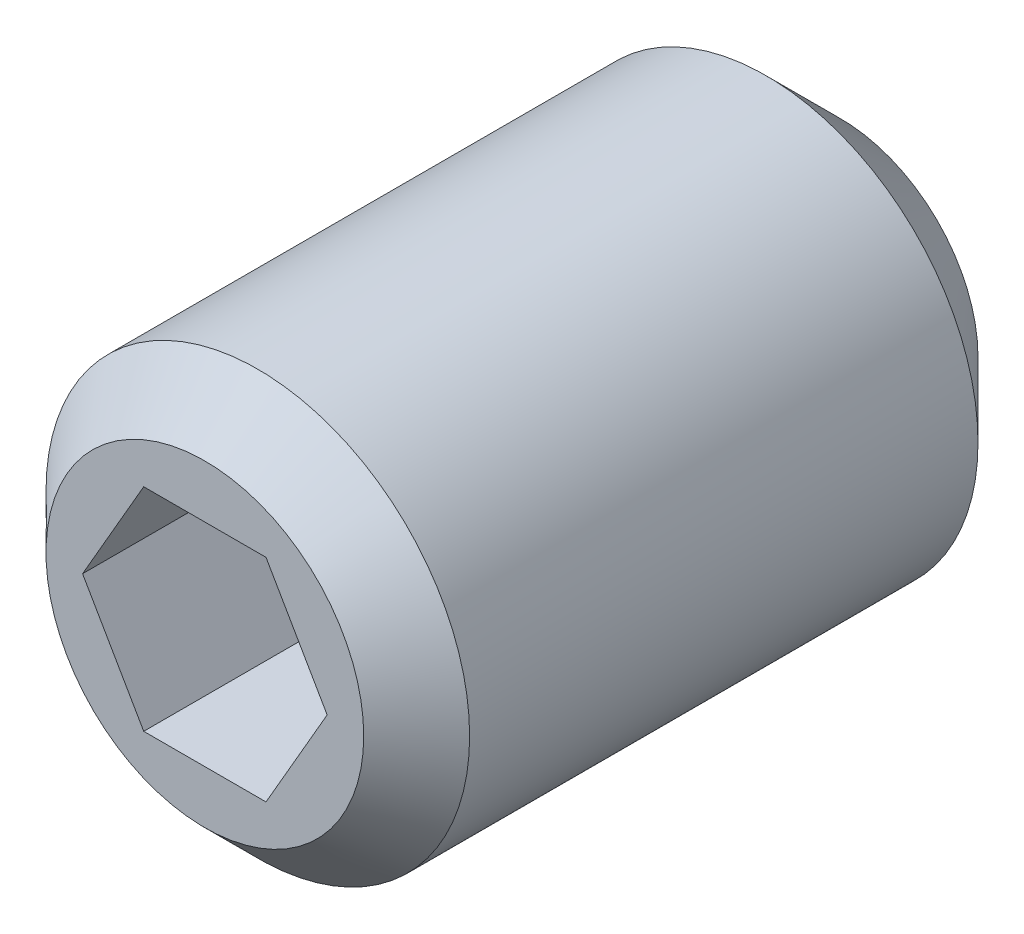
ISO-10303-21;
HEADER;
FILE_DESCRIPTION(('STEP AP214'),'2;1');
FILE_NAME('part.step','',(''),(''),'','','');
FILE_SCHEMA(('AUTOMOTIVE_DESIGN { 1 0 10303 214 1 1 1 1 }'));
ENDSEC;
DATA;
#1=APPLICATION_CONTEXT('core data for automotive mechanical design processes');
#2=APPLICATION_PROTOCOL_DEFINITION('international standard','automotive_design',2000,#1);
#3=PRODUCT_CONTEXT('',#1,'mechanical');
#4=PRODUCT('Part','Part','',(#3));
#5=PRODUCT_RELATED_PRODUCT_CATEGORY('part','',(#4));
#6=PRODUCT_DEFINITION_FORMATION('','',#4);
#7=PRODUCT_DEFINITION_CONTEXT('part definition',#1,'design');
#8=PRODUCT_DEFINITION('design','',#6,#7);
#9=PRODUCT_DEFINITION_SHAPE('','',#8);
#10=(LENGTH_UNIT() NAMED_UNIT(*) SI_UNIT(.MILLI.,.METRE.));
#11=(NAMED_UNIT(*) PLANE_ANGLE_UNIT() SI_UNIT($,.RADIAN.));
#12=(NAMED_UNIT(*) SI_UNIT($,.STERADIAN.) SOLID_ANGLE_UNIT());
#13=UNCERTAINTY_MEASURE_WITH_UNIT(LENGTH_MEASURE(1.E-05),#10,'distance_accuracy_value','');
#14=(GEOMETRIC_REPRESENTATION_CONTEXT(3) GLOBAL_UNCERTAINTY_ASSIGNED_CONTEXT((#13)) GLOBAL_UNIT_ASSIGNED_CONTEXT((#10,
#11,#12)) REPRESENTATION_CONTEXT('',''));
#15=CARTESIAN_POINT('',(0.,0.,0.));
#16=DIRECTION('',(0.,0.,1.));
#17=DIRECTION('',(1.,0.,0.));
#18=AXIS2_PLACEMENT_3D('',#15,#16,#17);
#19=CARTESIAN_POINT('',(0.,0.,3.));
#20=DIRECTION('',(0.,0.,-1.));
#21=DIRECTION('',(-1.,0.,0.));
#22=AXIS2_PLACEMENT_3D('',#19,#20,#21);
#23=CYLINDRICAL_SURFACE('',#22,2.);
#24=CARTESIAN_POINT('',(0.,0.,2.5));
#25=DIRECTION('',(0.,0.,1.));
#26=DIRECTION('',(1.,0.,0.));
#27=AXIS2_PLACEMENT_3D('',#24,#25,#26);
#28=CIRCLE('',#27,2.);
#29=CARTESIAN_POINT('',(2.,0.,2.5));
#30=VERTEX_POINT('',#29);
#31=EDGE_CURVE('E11',#30,#30,#28,.F.);
#32=ORIENTED_EDGE('',*,*,#31,.T.);
#33=EDGE_LOOP('',(#32));
#34=FACE_BOUND('',#33,.T.);
#35=CARTESIAN_POINT('',(0.,0.,-2.29999999999999));
#36=DIRECTION('',(0.,0.,1.));
#37=DIRECTION('',(1.,0.,0.));
#38=AXIS2_PLACEMENT_3D('',#35,#36,#37);
#39=CIRCLE('',#38,2.);
#40=CARTESIAN_POINT('',(2.,0.,-2.29999999999999));
#41=VERTEX_POINT('',#40);
#42=EDGE_CURVE('E118',#41,#41,#39,.T.);
#43=ORIENTED_EDGE('',*,*,#42,.T.);
#44=EDGE_LOOP('',(#43));
#45=FACE_BOUND('',#44,.T.);
#46=ADVANCED_FACE('F43',(#34,#45),#23,.T.);
#47=CARTESIAN_POINT('',(0.,0.,3.));
#48=DIRECTION('',(0.,0.,1.));
#49=DIRECTION('',(1.,0.,0.));
#50=AXIS2_PLACEMENT_3D('',#47,#48,#49);
#51=PLANE('',#50);
#52=CARTESIAN_POINT('',(0.,0.,3.));
#53=DIRECTION('',(0.,0.,1.));
#54=DIRECTION('',(1.,0.,0.));
#55=AXIS2_PLACEMENT_3D('',#52,#53,#54);
#56=CIRCLE('',#55,1.49999999999999);
#57=CARTESIAN_POINT('',(1.49999999999999,0.,3.));
#58=VERTEX_POINT('',#57);
#59=EDGE_CURVE('E51',#58,#58,#56,.T.);
#60=ORIENTED_EDGE('',*,*,#59,.T.);
#61=EDGE_LOOP('',(#60));
#62=FACE_BOUND('',#61,.T.);
#63=DIRECTION('',(-0.5,0.866025403784439,0.));
#64=VECTOR('',#63,1.);
#65=CARTESIAN_POINT('',(1.15470053837925,0.,3.));
#66=LINE('',#65,#64);
#67=CARTESIAN_POINT('',(1.15470053837925,0.,3.));
#68=VERTEX_POINT('',#67);
#69=CARTESIAN_POINT('',(0.577350269189626,1.,3.));
#70=VERTEX_POINT('',#69);
#71=EDGE_CURVE('E58',#68,#70,#66,.T.);
#72=ORIENTED_EDGE('',*,*,#71,.F.);
#73=DIRECTION('',(0.5,0.866025403784439,0.));
#74=VECTOR('',#73,1.);
#75=CARTESIAN_POINT('',(0.577350269189626,-1.,3.));
#76=LINE('',#75,#74);
#77=CARTESIAN_POINT('',(0.577350269189626,-1.,3.));
#78=VERTEX_POINT('',#77);
#79=EDGE_CURVE('E93',#78,#68,#76,.T.);
#80=ORIENTED_EDGE('',*,*,#79,.F.);
#81=DIRECTION('',(1.,0.,0.));
#82=VECTOR('',#81,1.);
#83=CARTESIAN_POINT('',(-0.577350269189626,-1.,3.));
#84=LINE('',#83,#82);
#85=CARTESIAN_POINT('',(-0.577350269189626,-1.,3.));
#86=VERTEX_POINT('',#85);
#87=EDGE_CURVE('E101',#86,#78,#84,.T.);
#88=ORIENTED_EDGE('',*,*,#87,.F.);
#89=DIRECTION('',(0.499999999999999,-0.866025403784439,0.));
#90=VECTOR('',#89,1.);
#91=CARTESIAN_POINT('',(-1.15470053837925,0.,3.));
#92=LINE('',#91,#90);
#93=CARTESIAN_POINT('',(-1.15470053837925,0.,3.));
#94=VERTEX_POINT('',#93);
#95=EDGE_CURVE('E107',#94,#86,#92,.T.);
#96=ORIENTED_EDGE('',*,*,#95,.F.);
#97=DIRECTION('',(-0.499999999999999,-0.866025403784439,0.));
#98=VECTOR('',#97,1.);
#99=CARTESIAN_POINT('',(-0.577350269189626,1.,3.));
#100=LINE('',#99,#98);
#101=CARTESIAN_POINT('',(-0.577350269189626,1.,3.));
#102=VERTEX_POINT('',#101);
#103=EDGE_CURVE('E376',#102,#94,#100,.T.);
#104=ORIENTED_EDGE('',*,*,#103,.F.);
#105=DIRECTION('',(-1.,0.,0.));
#106=VECTOR('',#105,1.);
#107=CARTESIAN_POINT('',(0.577350269189626,1.,3.));
#108=LINE('',#107,#106);
#109=EDGE_CURVE('E359',#70,#102,#108,.T.);
#110=ORIENTED_EDGE('',*,*,#109,.F.);
#111=EDGE_LOOP('',(#72,#80,#88,#96,#104,#110));
#112=FACE_BOUND('',#111,.T.);
#113=ADVANCED_FACE('F109',(#62,#112),#51,.T.);
#114=CARTESIAN_POINT('',(0.,0.,-3.));
#115=DIRECTION('',(0.,0.,1.));
#116=DIRECTION('',(1.,0.,0.));
#117=AXIS2_PLACEMENT_3D('',#114,#115,#116);
#118=PLANE('',#117);
#119=CARTESIAN_POINT('',(0.,0.,-3.));
#120=DIRECTION('',(0.,0.,1.));
#121=DIRECTION('',(1.,0.,0.));
#122=AXIS2_PLACEMENT_3D('',#119,#120,#121);
#123=CIRCLE('',#122,1.3);
#124=CARTESIAN_POINT('',(1.3,0.,-3.));
#125=VERTEX_POINT('',#124);
#126=EDGE_CURVE('E129',#125,#125,#123,.F.);
#127=ORIENTED_EDGE('',*,*,#126,.T.);
#128=EDGE_LOOP('',(#127));
#129=FACE_BOUND('',#128,.T.);
#130=ADVANCED_FACE('F151',(#129),#118,.F.);
#131=CARTESIAN_POINT('',(0.,0.,-2.29999999999999));
#132=DIRECTION('',(0.,0.,1.));
#133=DIRECTION('',(1.,0.,0.));
#134=AXIS2_PLACEMENT_3D('',#131,#132,#133);
#135=CONICAL_SURFACE('',#134,2.,0.785398163397443);
#136=ORIENTED_EDGE('',*,*,#126,.F.);
#137=EDGE_LOOP('',(#136));
#138=FACE_BOUND('',#137,.T.);
#139=ORIENTED_EDGE('',*,*,#42,.F.);
#140=EDGE_LOOP('',(#139));
#141=FACE_BOUND('',#140,.T.);
#142=ADVANCED_FACE('F155',(#138,#141),#135,.T.);
#143=CARTESIAN_POINT('',(1.15470053837925,0.,1.));
#144=DIRECTION('',(0.866025403784439,0.5,0.));
#145=DIRECTION('',(-0.5,0.866025403784439,0.));
#146=AXIS2_PLACEMENT_3D('',#143,#144,#145);
#147=PLANE('',#146);
#148=ORIENTED_EDGE('',*,*,#71,.T.);
#149=DIRECTION('',(0.,0.,1.));
#150=VECTOR('',#149,1.);
#151=CARTESIAN_POINT('',(0.577350269189626,1.,1.));
#152=LINE('',#151,#150);
#153=CARTESIAN_POINT('',(0.577350269189626,1.,1.));
#154=VERTEX_POINT('',#153);
#155=EDGE_CURVE('E125',#154,#70,#152,.T.);
#156=ORIENTED_EDGE('',*,*,#155,.F.);
#157=DIRECTION('',(-0.5,0.866025403784439,0.));
#158=VECTOR('',#157,1.);
#159=CARTESIAN_POINT('',(1.15470053837925,0.,1.));
#160=LINE('',#159,#158);
#161=CARTESIAN_POINT('',(1.15470053837925,0.,1.));
#162=VERTEX_POINT('',#161);
#163=EDGE_CURVE('E111',#162,#154,#160,.T.);
#164=ORIENTED_EDGE('',*,*,#163,.F.);
#165=DIRECTION('',(0.,0.,1.));
#166=VECTOR('',#165,1.);
#167=CARTESIAN_POINT('',(1.15470053837925,0.,1.));
#168=LINE('',#167,#166);
#169=EDGE_CURVE('E97',#162,#68,#168,.T.);
#170=ORIENTED_EDGE('',*,*,#169,.T.);
#171=EDGE_LOOP('',(#148,#156,#164,#170));
#172=FACE_BOUND('',#171,.T.);
#173=ADVANCED_FACE('F157',(#172),#147,.F.);
#174=CARTESIAN_POINT('',(0.577350269189626,-1.,1.));
#175=DIRECTION('',(0.866025403784439,-0.499999999999999,0.));
#176=DIRECTION('',(0.5,0.866025403784439,0.));
#177=AXIS2_PLACEMENT_3D('',#174,#175,#176);
#178=PLANE('',#177);
#179=ORIENTED_EDGE('',*,*,#79,.T.);
#180=ORIENTED_EDGE('',*,*,#169,.F.);
#181=DIRECTION('',(0.5,0.866025403784439,0.));
#182=VECTOR('',#181,1.);
#183=CARTESIAN_POINT('',(0.577350269189626,-1.,1.));
#184=LINE('',#183,#182);
#185=CARTESIAN_POINT('',(0.577350269189626,-1.,1.));
#186=VERTEX_POINT('',#185);
#187=EDGE_CURVE('E95',#186,#162,#184,.T.);
#188=ORIENTED_EDGE('',*,*,#187,.F.);
#189=DIRECTION('',(0.,0.,1.));
#190=VECTOR('',#189,1.);
#191=CARTESIAN_POINT('',(0.577350269189626,-1.,1.));
#192=LINE('',#191,#190);
#193=EDGE_CURVE('E88',#186,#78,#192,.T.);
#194=ORIENTED_EDGE('',*,*,#193,.T.);
#195=EDGE_LOOP('',(#179,#180,#188,#194));
#196=FACE_BOUND('',#195,.T.);
#197=ADVANCED_FACE('F90',(#196),#178,.F.);
#198=CARTESIAN_POINT('',(-0.577350269189626,-1.,1.));
#199=DIRECTION('',(0.,-1.,0.));
#200=DIRECTION('',(1.,0.,0.));
#201=AXIS2_PLACEMENT_3D('',#198,#199,#200);
#202=PLANE('',#201);
#203=ORIENTED_EDGE('',*,*,#87,.T.);
#204=ORIENTED_EDGE('',*,*,#193,.F.);
#205=DIRECTION('',(1.,0.,0.));
#206=VECTOR('',#205,1.);
#207=CARTESIAN_POINT('',(-0.577350269189626,-1.,1.));
#208=LINE('',#207,#206);
#209=CARTESIAN_POINT('',(-0.577350269189626,-1.,1.));
#210=VERTEX_POINT('',#209);
#211=EDGE_CURVE('E67',#210,#186,#208,.T.);
#212=ORIENTED_EDGE('',*,*,#211,.F.);
#213=DIRECTION('',(0.,0.,1.));
#214=VECTOR('',#213,1.);
#215=CARTESIAN_POINT('',(-0.577350269189626,-1.,1.));
#216=LINE('',#215,#214);
#217=EDGE_CURVE('E98',#210,#86,#216,.T.);
#218=ORIENTED_EDGE('',*,*,#217,.T.);
#219=EDGE_LOOP('',(#203,#204,#212,#218));
#220=FACE_BOUND('',#219,.T.);
#221=ADVANCED_FACE('F102',(#220),#202,.F.);
#222=CARTESIAN_POINT('',(-1.15470053837925,0.,1.));
#223=DIRECTION('',(-0.866025403784439,-0.499999999999999,0.));
#224=DIRECTION('',(0.499999999999999,-0.866025403784439,0.));
#225=AXIS2_PLACEMENT_3D('',#222,#223,#224);
#226=PLANE('',#225);
#227=ORIENTED_EDGE('',*,*,#95,.T.);
#228=ORIENTED_EDGE('',*,*,#217,.F.);
#229=DIRECTION('',(0.499999999999999,-0.866025403784439,0.));
#230=VECTOR('',#229,1.);
#231=CARTESIAN_POINT('',(-1.15470053837925,0.,1.));
#232=LINE('',#231,#230);
#233=CARTESIAN_POINT('',(-1.15470053837925,0.,1.));
#234=VERTEX_POINT('',#233);
#235=EDGE_CURVE('E366',#234,#210,#232,.T.);
#236=ORIENTED_EDGE('',*,*,#235,.F.);
#237=DIRECTION('',(0.,0.,1.));
#238=VECTOR('',#237,1.);
#239=CARTESIAN_POINT('',(-1.15470053837925,0.,1.));
#240=LINE('',#239,#238);
#241=EDGE_CURVE('E121',#234,#94,#240,.T.);
#242=ORIENTED_EDGE('',*,*,#241,.T.);
#243=EDGE_LOOP('',(#227,#228,#236,#242));
#244=FACE_BOUND('',#243,.T.);
#245=ADVANCED_FACE('F203',(#244),#226,.F.);
#246=CARTESIAN_POINT('',(-0.577350269189626,1.,1.));
#247=DIRECTION('',(-0.866025403784439,0.499999999999999,0.));
#248=DIRECTION('',(-0.499999999999999,-0.866025403784439,0.));
#249=AXIS2_PLACEMENT_3D('',#246,#247,#248);
#250=PLANE('',#249);
#251=ORIENTED_EDGE('',*,*,#103,.T.);
#252=ORIENTED_EDGE('',*,*,#241,.F.);
#253=DIRECTION('',(-0.499999999999999,-0.866025403784439,0.));
#254=VECTOR('',#253,1.);
#255=CARTESIAN_POINT('',(-0.577350269189626,1.,1.));
#256=LINE('',#255,#254);
#257=CARTESIAN_POINT('',(-0.577350269189626,1.,1.));
#258=VERTEX_POINT('',#257);
#259=EDGE_CURVE('E355',#258,#234,#256,.T.);
#260=ORIENTED_EDGE('',*,*,#259,.F.);
#261=DIRECTION('',(0.,0.,1.));
#262=VECTOR('',#261,1.);
#263=CARTESIAN_POINT('',(-0.577350269189626,1.,1.));
#264=LINE('',#263,#262);
#265=EDGE_CURVE('E123',#258,#102,#264,.T.);
#266=ORIENTED_EDGE('',*,*,#265,.T.);
#267=EDGE_LOOP('',(#251,#252,#260,#266));
#268=FACE_BOUND('',#267,.T.);
#269=ADVANCED_FACE('F212',(#268),#250,.F.);
#270=CARTESIAN_POINT('',(0.577350269189626,1.,1.));
#271=DIRECTION('',(0.,1.,0.));
#272=DIRECTION('',(-1.,0.,0.));
#273=AXIS2_PLACEMENT_3D('',#270,#271,#272);
#274=PLANE('',#273);
#275=ORIENTED_EDGE('',*,*,#109,.T.);
#276=ORIENTED_EDGE('',*,*,#265,.F.);
#277=DIRECTION('',(-1.,0.,0.));
#278=VECTOR('',#277,1.);
#279=CARTESIAN_POINT('',(0.577350269189626,1.,1.));
#280=LINE('',#279,#278);
#281=EDGE_CURVE('E114',#154,#258,#280,.T.);
#282=ORIENTED_EDGE('',*,*,#281,.F.);
#283=ORIENTED_EDGE('',*,*,#155,.T.);
#284=EDGE_LOOP('',(#275,#276,#282,#283));
#285=FACE_BOUND('',#284,.T.);
#286=ADVANCED_FACE('F222',(#285),#274,.F.);
#287=CARTESIAN_POINT('',(-0.577350269189626,-1.,1.));
#288=CARTESIAN_POINT('',(-0.548482755730145,-0.950000000000001,0.5));
#289=CARTESIAN_POINT('',(0.,0.,0.5));
#290=CARTESIAN_POINT('',(0.577350269189626,-1.,1.));
#291=CARTESIAN_POINT('',(0.548482755730144,-0.95,0.5));
#292=CARTESIAN_POINT('',(0.,0.,0.5));
#293=(BOUNDED_SURFACE() B_SPLINE_SURFACE(1,2,((#287,#288,#289),(#290,#291,#292)),.UNSPECIFIED.,
.F.,.F.,.F.) B_SPLINE_SURFACE_WITH_KNOTS((2,2),(3,3),(0.,1.),(0.,1.),
.UNSPECIFIED.) GEOMETRIC_REPRESENTATION_ITEM() RATIONAL_B_SPLINE_SURFACE(((1.,1.,1.),(1.,1.,1.))) REPRESENTATION_ITEM('') SURFACE());
#294=CARTESIAN_POINT('',(0.577350269189626,-1.,1.));
#295=CARTESIAN_POINT('',(0.548482755730144,-0.95,0.5));
#296=CARTESIAN_POINT('',(0.,0.,0.5));
#297=(BOUNDED_CURVE() B_SPLINE_CURVE(2,(#294,#295,#296),.UNSPECIFIED.,.F.,
.F.) B_SPLINE_CURVE_WITH_KNOTS((3,3),(0.,1.),
.UNSPECIFIED.) CURVE() GEOMETRIC_REPRESENTATION_ITEM() RATIONAL_B_SPLINE_CURVE((1.,1.,1.)) REPRESENTATION_ITEM(''));
#298=CARTESIAN_POINT('',(0.,0.,0.5));
#299=VERTEX_POINT('',#298);
#300=EDGE_CURVE('E374',#186,#299,#297,.T.);
#301=CARTESIAN_POINT('',(-0.577350269189626,-1.,1.));
#302=CARTESIAN_POINT('',(-0.548482755730145,-0.950000000000001,0.5));
#303=CARTESIAN_POINT('',(0.,0.,0.5));
#304=(BOUNDED_CURVE() B_SPLINE_CURVE(2,(#301,#302,#303),.UNSPECIFIED.,.F.,
.F.) B_SPLINE_CURVE_WITH_KNOTS((3,3),(0.,1.),
.UNSPECIFIED.) CURVE() GEOMETRIC_REPRESENTATION_ITEM() RATIONAL_B_SPLINE_CURVE((1.,1.,1.)) REPRESENTATION_ITEM(''));
#305=EDGE_CURVE('E381',#210,#299,#304,.T.);
#306=ORIENTED_EDGE('',*,*,#211,.T.);
#307=ORIENTED_EDGE('',*,*,#300,.T.);
#308=ORIENTED_EDGE('',*,*,#305,.F.);
#309=EDGE_LOOP('',(#306,#307,#308));
#310=FACE_BOUND('',#309,.T.);
#311=ADVANCED_FACE('F232',(#310),#293,.T.);
#312=CARTESIAN_POINT('',(-1.15470053837925,0.,1.));
#313=CARTESIAN_POINT('',(-1.09696551146029,0.,0.5));
#314=CARTESIAN_POINT('',(0.,0.,0.5));
#315=CARTESIAN_POINT('',(-0.577350269189626,-1.,1.));
#316=CARTESIAN_POINT('',(-0.548482755730145,-0.950000000000001,0.5));
#317=CARTESIAN_POINT('',(0.,0.,0.5));
#318=(BOUNDED_SURFACE() B_SPLINE_SURFACE(1,2,((#312,#313,#314),(#315,#316,#317)),.UNSPECIFIED.,
.F.,.F.,.F.) B_SPLINE_SURFACE_WITH_KNOTS((2,2),(3,3),(0.,1.),(0.,1.),
.UNSPECIFIED.) GEOMETRIC_REPRESENTATION_ITEM() RATIONAL_B_SPLINE_SURFACE(((1.,1.,1.),(1.,1.,1.))) REPRESENTATION_ITEM('') SURFACE());
#319=CARTESIAN_POINT('',(-1.15470053837925,0.,1.));
#320=CARTESIAN_POINT('',(-1.09696551146029,0.,0.5));
#321=CARTESIAN_POINT('',(0.,0.,0.5));
#322=(BOUNDED_CURVE() B_SPLINE_CURVE(2,(#319,#320,#321),.UNSPECIFIED.,.F.,
.F.) B_SPLINE_CURVE_WITH_KNOTS((3,3),(0.,1.),
.UNSPECIFIED.) CURVE() GEOMETRIC_REPRESENTATION_ITEM() RATIONAL_B_SPLINE_CURVE((1.,1.,1.)) REPRESENTATION_ITEM(''));
#323=EDGE_CURVE('E382',#234,#299,#322,.T.);
#324=ORIENTED_EDGE('',*,*,#235,.T.);
#325=ORIENTED_EDGE('',*,*,#305,.T.);
#326=ORIENTED_EDGE('',*,*,#323,.F.);
#327=EDGE_LOOP('',(#324,#325,#326));
#328=FACE_BOUND('',#327,.T.);
#329=ADVANCED_FACE('F242',(#328),#318,.T.);
#330=CARTESIAN_POINT('',(-0.577350269189626,1.,1.));
#331=CARTESIAN_POINT('',(-0.548482755730144,0.950000000000001,0.5));
#332=CARTESIAN_POINT('',(0.,0.,0.5));
#333=CARTESIAN_POINT('',(-1.15470053837925,0.,1.));
#334=CARTESIAN_POINT('',(-1.09696551146029,0.,0.5));
#335=CARTESIAN_POINT('',(0.,0.,0.5));
#336=(BOUNDED_SURFACE() B_SPLINE_SURFACE(1,2,((#330,#331,#332),(#333,#334,#335)),.UNSPECIFIED.,
.F.,.F.,.F.) B_SPLINE_SURFACE_WITH_KNOTS((2,2),(3,3),(0.,1.),(0.,1.),
.UNSPECIFIED.) GEOMETRIC_REPRESENTATION_ITEM() RATIONAL_B_SPLINE_SURFACE(((1.,1.,1.),(1.,1.,1.))) REPRESENTATION_ITEM('') SURFACE());
#337=CARTESIAN_POINT('',(-0.577350269189626,1.,1.));
#338=CARTESIAN_POINT('',(-0.548482755730144,0.950000000000001,0.5));
#339=CARTESIAN_POINT('',(0.,0.,0.5));
#340=(BOUNDED_CURVE() B_SPLINE_CURVE(2,(#337,#338,#339),.UNSPECIFIED.,.F.,
.F.) B_SPLINE_CURVE_WITH_KNOTS((3,3),(0.,1.),
.UNSPECIFIED.) CURVE() GEOMETRIC_REPRESENTATION_ITEM() RATIONAL_B_SPLINE_CURVE((1.,1.,1.)) REPRESENTATION_ITEM(''));
#341=EDGE_CURVE('E349',#258,#299,#340,.T.);
#342=ORIENTED_EDGE('',*,*,#259,.T.);
#343=ORIENTED_EDGE('',*,*,#323,.T.);
#344=ORIENTED_EDGE('',*,*,#341,.F.);
#345=EDGE_LOOP('',(#342,#343,#344));
#346=FACE_BOUND('',#345,.T.);
#347=ADVANCED_FACE('F251',(#346),#336,.T.);
#348=CARTESIAN_POINT('',(0.577350269189626,-1.,1.));
#349=CARTESIAN_POINT('',(0.548482755730144,-0.95,0.5));
#350=CARTESIAN_POINT('',(0.,0.,0.5));
#351=CARTESIAN_POINT('',(1.15470053837925,0.,1.));
#352=CARTESIAN_POINT('',(1.09696551146029,0.,0.5));
#353=CARTESIAN_POINT('',(0.,0.,0.5));
#354=(BOUNDED_SURFACE() B_SPLINE_SURFACE(1,2,((#348,#349,#350),(#351,#352,#353)),.UNSPECIFIED.,
.F.,.F.,.F.) B_SPLINE_SURFACE_WITH_KNOTS((2,2),(3,3),(0.,1.),(0.,1.),
.UNSPECIFIED.) GEOMETRIC_REPRESENTATION_ITEM() RATIONAL_B_SPLINE_SURFACE(((1.,1.,1.),(1.,1.,1.))) REPRESENTATION_ITEM('') SURFACE());
#355=CARTESIAN_POINT('',(1.15470053837925,0.,1.));
#356=CARTESIAN_POINT('',(1.09696551146029,0.,0.5));
#357=CARTESIAN_POINT('',(0.,0.,0.5));
#358=(BOUNDED_CURVE() B_SPLINE_CURVE(2,(#355,#356,#357),.UNSPECIFIED.,.F.,
.F.) B_SPLINE_CURVE_WITH_KNOTS((3,3),(0.,1.),
.UNSPECIFIED.) CURVE() GEOMETRIC_REPRESENTATION_ITEM() RATIONAL_B_SPLINE_CURVE((1.,1.,1.)) REPRESENTATION_ITEM(''));
#359=EDGE_CURVE('E388',#299,#162,#358,.F.);
#360=ORIENTED_EDGE('',*,*,#187,.T.);
#361=ORIENTED_EDGE('',*,*,#359,.F.);
#362=ORIENTED_EDGE('',*,*,#300,.F.);
#363=EDGE_LOOP('',(#360,#361,#362));
#364=FACE_BOUND('',#363,.T.);
#365=ADVANCED_FACE('F261',(#364),#354,.T.);
#366=CARTESIAN_POINT('',(0.577350269189626,1.,1.));
#367=CARTESIAN_POINT('',(0.548482755730144,0.95,0.5));
#368=CARTESIAN_POINT('',(0.,0.,0.5));
#369=CARTESIAN_POINT('',(-0.577350269189626,1.,1.));
#370=CARTESIAN_POINT('',(-0.548482755730144,0.950000000000001,0.5));
#371=CARTESIAN_POINT('',(0.,0.,0.5));
#372=(BOUNDED_SURFACE() B_SPLINE_SURFACE(1,2,((#366,#367,#368),(#369,#370,#371)),.UNSPECIFIED.,
.F.,.F.,.F.) B_SPLINE_SURFACE_WITH_KNOTS((2,2),(3,3),(0.,1.),(0.,1.),
.UNSPECIFIED.) GEOMETRIC_REPRESENTATION_ITEM() RATIONAL_B_SPLINE_SURFACE(((1.,1.,1.),(1.,1.,1.))) REPRESENTATION_ITEM('') SURFACE());
#373=CARTESIAN_POINT('',(0.577350269189626,1.,1.));
#374=CARTESIAN_POINT('',(0.548482755730144,0.95,0.5));
#375=CARTESIAN_POINT('',(0.,0.,0.5));
#376=(BOUNDED_CURVE() B_SPLINE_CURVE(2,(#373,#374,#375),.UNSPECIFIED.,.F.,
.F.) B_SPLINE_CURVE_WITH_KNOTS((3,3),(0.,1.),
.UNSPECIFIED.) CURVE() GEOMETRIC_REPRESENTATION_ITEM() RATIONAL_B_SPLINE_CURVE((1.,1.,1.)) REPRESENTATION_ITEM(''));
#377=EDGE_CURVE('E352',#154,#299,#376,.T.);
#378=ORIENTED_EDGE('',*,*,#281,.T.);
#379=ORIENTED_EDGE('',*,*,#341,.T.);
#380=ORIENTED_EDGE('',*,*,#377,.F.);
#381=EDGE_LOOP('',(#378,#379,#380));
#382=FACE_BOUND('',#381,.T.);
#383=ADVANCED_FACE('F142',(#382),#372,.T.);
#384=CARTESIAN_POINT('',(1.15470053837925,0.,1.));
#385=CARTESIAN_POINT('',(1.09696551146029,0.,0.5));
#386=CARTESIAN_POINT('',(0.,0.,0.5));
#387=CARTESIAN_POINT('',(0.577350269189626,1.,1.));
#388=CARTESIAN_POINT('',(0.548482755730144,0.95,0.5));
#389=CARTESIAN_POINT('',(0.,0.,0.5));
#390=(BOUNDED_SURFACE() B_SPLINE_SURFACE(1,2,((#384,#385,#386),(#387,#388,#389)),.UNSPECIFIED.,
.F.,.F.,.F.) B_SPLINE_SURFACE_WITH_KNOTS((2,2),(3,3),(0.,1.),(0.,1.),
.UNSPECIFIED.) GEOMETRIC_REPRESENTATION_ITEM() RATIONAL_B_SPLINE_SURFACE(((1.,1.,1.),(1.,1.,1.))) REPRESENTATION_ITEM('') SURFACE());
#391=ORIENTED_EDGE('',*,*,#163,.T.);
#392=ORIENTED_EDGE('',*,*,#377,.T.);
#393=ORIENTED_EDGE('',*,*,#359,.T.);
#394=EDGE_LOOP('',(#391,#392,#393));
#395=FACE_BOUND('',#394,.T.);
#396=ADVANCED_FACE('F136',(#395),#390,.T.);
#397=CARTESIAN_POINT('',(0.,0.,3.));
#398=DIRECTION('',(0.,0.,-1.));
#399=DIRECTION('',(-1.,0.,0.));
#400=AXIS2_PLACEMENT_3D('',#397,#398,#399);
#401=CONICAL_SURFACE('',#400,1.49999999999999,0.785398163397453);
#402=ORIENTED_EDGE('',*,*,#31,.F.);
#403=EDGE_LOOP('',(#402));
#404=FACE_BOUND('',#403,.T.);
#405=ORIENTED_EDGE('',*,*,#59,.F.);
#406=EDGE_LOOP('',(#405));
#407=FACE_BOUND('',#406,.T.);
#408=ADVANCED_FACE('F45',(#404,#407),#401,.T.);
#409=CLOSED_SHELL('',(#46,#113,#130,#142,#173,#197,#221,#245,#269,#286,#311,#329,#347,#365,#383,
#396,#408));
#410=MANIFOLD_SOLID_BREP('B2',#409);
#411=ADVANCED_BREP_SHAPE_REPRESENTATION('',(#18,#410),#14);
#412=SHAPE_DEFINITION_REPRESENTATION(#9,#411);
ENDSEC;
END-ISO-10303-21;
